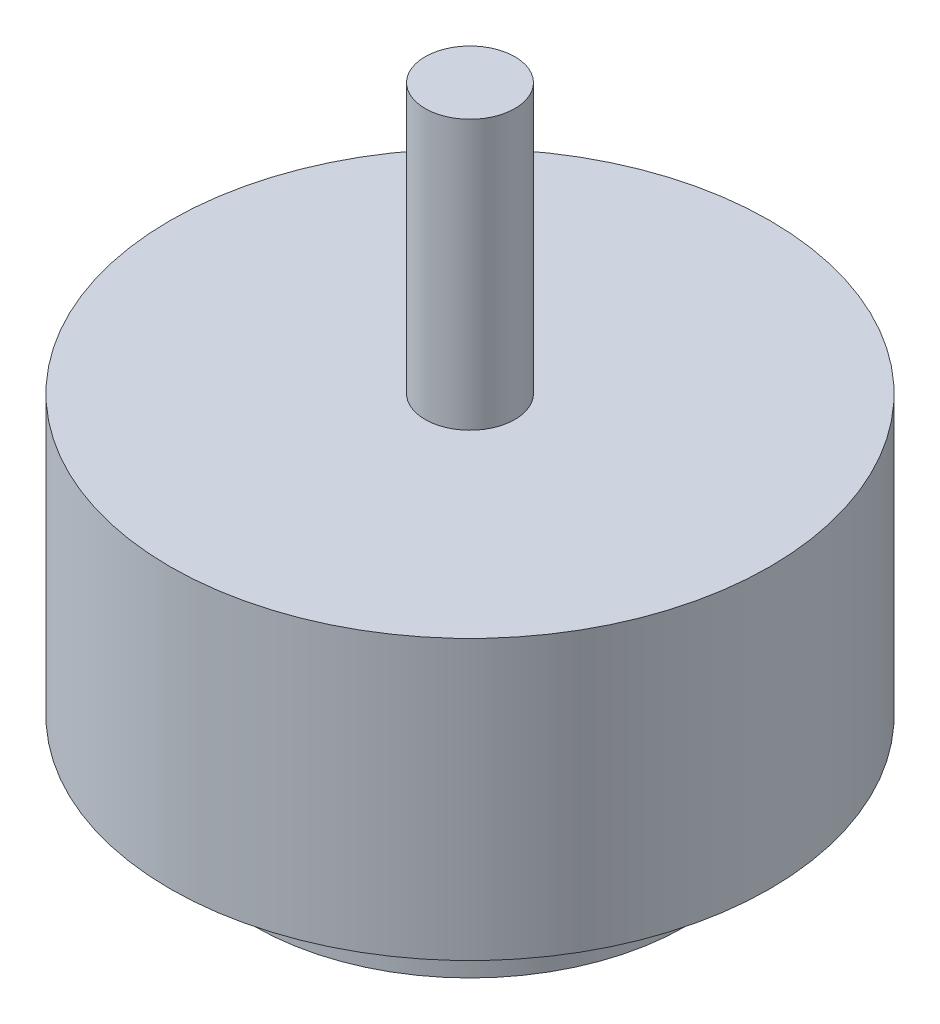
ISO-10303-21;
HEADER;
FILE_DESCRIPTION(('STEP AP214'),'2;1');
FILE_NAME('part.step','',(''),(''),'','','');
FILE_SCHEMA(('AUTOMOTIVE_DESIGN { 1 0 10303 214 1 1 1 1 }'));
ENDSEC;
DATA;
#1=APPLICATION_CONTEXT('core data for automotive mechanical design processes');
#2=APPLICATION_PROTOCOL_DEFINITION('international standard','automotive_design',2000,#1);
#3=PRODUCT_CONTEXT('',#1,'mechanical');
#4=PRODUCT('Part','Part','',(#3));
#5=PRODUCT_RELATED_PRODUCT_CATEGORY('part','',(#4));
#6=PRODUCT_DEFINITION_FORMATION('','',#4);
#7=PRODUCT_DEFINITION_CONTEXT('part definition',#1,'design');
#8=PRODUCT_DEFINITION('design','',#6,#7);
#9=PRODUCT_DEFINITION_SHAPE('','',#8);
#10=(LENGTH_UNIT() NAMED_UNIT(*) SI_UNIT(.MILLI.,.METRE.));
#11=(NAMED_UNIT(*) PLANE_ANGLE_UNIT() SI_UNIT($,.RADIAN.));
#12=(NAMED_UNIT(*) SI_UNIT($,.STERADIAN.) SOLID_ANGLE_UNIT());
#13=UNCERTAINTY_MEASURE_WITH_UNIT(LENGTH_MEASURE(1.E-05),#10,'distance_accuracy_value','');
#14=(GEOMETRIC_REPRESENTATION_CONTEXT(3) GLOBAL_UNCERTAINTY_ASSIGNED_CONTEXT((#13)) GLOBAL_UNIT_ASSIGNED_CONTEXT((#10,
#11,#12)) REPRESENTATION_CONTEXT('',''));
#15=CARTESIAN_POINT('',(0.,0.,0.));
#16=DIRECTION('',(0.,0.,1.));
#17=DIRECTION('',(1.,0.,0.));
#18=AXIS2_PLACEMENT_3D('',#15,#16,#17);
#19=CARTESIAN_POINT('',(0.,0.,0.));
#20=DIRECTION('',(0.,1.,0.));
#21=DIRECTION('',(-1.,0.,0.));
#22=AXIS2_PLACEMENT_3D('',#19,#20,#21);
#23=PLANE('',#22);
#24=CARTESIAN_POINT('',(9.5,0.,0.));
#25=DIRECTION('',(0.,-1.,0.));
#26=DIRECTION('',(1.,0.,0.));
#27=AXIS2_PLACEMENT_3D('',#24,#25,#26);
#28=CIRCLE('',#27,1.5);
#29=CARTESIAN_POINT('',(11.,0.,0.));
#30=VERTEX_POINT('',#29);
#31=EDGE_CURVE('E75',#30,#30,#28,.T.);
#32=ORIENTED_EDGE('',*,*,#31,.F.);
#33=EDGE_LOOP('',(#32));
#34=FACE_BOUND('',#33,.T.);
#35=CARTESIAN_POINT('',(0.,0.,-9.5));
#36=DIRECTION('',(0.,-1.,0.));
#37=DIRECTION('',(1.,0.,0.));
#38=AXIS2_PLACEMENT_3D('',#35,#36,#37);
#39=CIRCLE('',#38,1.5);
#40=CARTESIAN_POINT('',(1.49999999999997,0.,-9.5));
#41=VERTEX_POINT('',#40);
#42=EDGE_CURVE('E110',#41,#41,#39,.T.);
#43=ORIENTED_EDGE('',*,*,#42,.F.);
#44=EDGE_LOOP('',(#43));
#45=FACE_BOUND('',#44,.T.);
#46=CARTESIAN_POINT('',(-9.5,0.,0.));
#47=DIRECTION('',(0.,-1.,0.));
#48=DIRECTION('',(1.,0.,0.));
#49=AXIS2_PLACEMENT_3D('',#46,#47,#48);
#50=CIRCLE('',#49,1.5);
#51=CARTESIAN_POINT('',(-8.,0.,0.));
#52=VERTEX_POINT('',#51);
#53=EDGE_CURVE('E114',#52,#52,#50,.T.);
#54=ORIENTED_EDGE('',*,*,#53,.F.);
#55=EDGE_LOOP('',(#54));
#56=FACE_BOUND('',#55,.T.);
#57=CARTESIAN_POINT('',(0.,0.,9.5));
#58=DIRECTION('',(0.,-1.,0.));
#59=DIRECTION('',(1.,0.,0.));
#60=AXIS2_PLACEMENT_3D('',#57,#58,#59);
#61=CIRCLE('',#60,1.5);
#62=CARTESIAN_POINT('',(1.5000000000001,0.,9.5));
#63=VERTEX_POINT('',#62);
#64=EDGE_CURVE('E52',#63,#63,#61,.T.);
#65=ORIENTED_EDGE('',*,*,#64,.F.);
#66=EDGE_LOOP('',(#65));
#67=FACE_BOUND('',#66,.T.);
#68=CARTESIAN_POINT('',(0.,0.,0.));
#69=DIRECTION('',(0.,1.,0.));
#70=DIRECTION('',(-1.,0.,0.));
#71=AXIS2_PLACEMENT_3D('',#68,#69,#70);
#72=CIRCLE('',#71,12.);
#73=CARTESIAN_POINT('',(-12.,0.,0.));
#74=VERTEX_POINT('',#73);
#75=EDGE_CURVE('E43',#74,#74,#72,.T.);
#76=ORIENTED_EDGE('',*,*,#75,.F.);
#77=EDGE_LOOP('',(#76));
#78=FACE_BOUND('',#77,.T.);
#79=ADVANCED_FACE('F36',(#34,#45,#56,#67,#78),#23,.F.);
#80=CARTESIAN_POINT('',(0.,19.7,0.));
#81=DIRECTION('',(0.,1.,0.));
#82=DIRECTION('',(-1.,0.,0.));
#83=AXIS2_PLACEMENT_3D('',#80,#81,#82);
#84=CYLINDRICAL_SURFACE('',#83,12.);
#85=CARTESIAN_POINT('',(0.,2.,0.));
#86=DIRECTION('',(0.,1.,0.));
#87=DIRECTION('',(-1.,0.,0.));
#88=AXIS2_PLACEMENT_3D('',#85,#86,#87);
#89=CIRCLE('',#88,12.);
#90=CARTESIAN_POINT('',(-12.,2.,0.));
#91=VERTEX_POINT('',#90);
#92=EDGE_CURVE('E48',#91,#91,#89,.T.);
#93=ORIENTED_EDGE('',*,*,#92,.F.);
#94=EDGE_LOOP('',(#93));
#95=FACE_BOUND('',#94,.T.);
#96=ORIENTED_EDGE('',*,*,#75,.T.);
#97=EDGE_LOOP('',(#96));
#98=FACE_BOUND('',#97,.T.);
#99=ADVANCED_FACE('F99',(#95,#98),#84,.T.);
#100=CARTESIAN_POINT('',(12.,2.,0.));
#101=DIRECTION('',(0.,-1.,0.));
#102=DIRECTION('',(1.,0.,0.));
#103=AXIS2_PLACEMENT_3D('',#100,#101,#102);
#104=PLANE('',#103);
#105=CARTESIAN_POINT('',(9.5,2.,0.));
#106=DIRECTION('',(0.,-1.,0.));
#107=DIRECTION('',(1.,0.,0.));
#108=AXIS2_PLACEMENT_3D('',#105,#106,#107);
#109=CIRCLE('',#108,1.5);
#110=CARTESIAN_POINT('',(11.,2.,0.));
#111=VERTEX_POINT('',#110);
#112=EDGE_CURVE('E39',#111,#111,#109,.T.);
#113=ORIENTED_EDGE('',*,*,#112,.T.);
#114=EDGE_LOOP('',(#113));
#115=FACE_BOUND('',#114,.T.);
#116=CARTESIAN_POINT('',(0.,2.,-9.5));
#117=DIRECTION('',(0.,-1.,0.));
#118=DIRECTION('',(1.,0.,0.));
#119=AXIS2_PLACEMENT_3D('',#116,#117,#118);
#120=CIRCLE('',#119,1.5);
#121=CARTESIAN_POINT('',(1.49999999999997,2.,-9.5));
#122=VERTEX_POINT('',#121);
#123=EDGE_CURVE('E77',#122,#122,#120,.T.);
#124=ORIENTED_EDGE('',*,*,#123,.T.);
#125=EDGE_LOOP('',(#124));
#126=FACE_BOUND('',#125,.T.);
#127=CARTESIAN_POINT('',(-9.5,2.,0.));
#128=DIRECTION('',(0.,-1.,0.));
#129=DIRECTION('',(1.,0.,0.));
#130=AXIS2_PLACEMENT_3D('',#127,#128,#129);
#131=CIRCLE('',#130,1.5);
#132=CARTESIAN_POINT('',(-8.,2.,0.));
#133=VERTEX_POINT('',#132);
#134=EDGE_CURVE('E74',#133,#133,#131,.T.);
#135=ORIENTED_EDGE('',*,*,#134,.T.);
#136=EDGE_LOOP('',(#135));
#137=FACE_BOUND('',#136,.T.);
#138=CARTESIAN_POINT('',(0.,2.,9.5));
#139=DIRECTION('',(0.,-1.,0.));
#140=DIRECTION('',(1.,0.,0.));
#141=AXIS2_PLACEMENT_3D('',#138,#139,#140);
#142=CIRCLE('',#141,1.5);
#143=CARTESIAN_POINT('',(1.5000000000001,2.,9.5));
#144=VERTEX_POINT('',#143);
#145=EDGE_CURVE('E71',#144,#144,#142,.T.);
#146=ORIENTED_EDGE('',*,*,#145,.T.);
#147=EDGE_LOOP('',(#146));
#148=FACE_BOUND('',#147,.T.);
#149=CARTESIAN_POINT('',(0.,2.,0.));
#150=DIRECTION('',(0.,1.,0.));
#151=DIRECTION('',(-1.,0.,0.));
#152=AXIS2_PLACEMENT_3D('',#149,#150,#151);
#153=CIRCLE('',#152,4.86486486486486);
#154=CARTESIAN_POINT('',(-4.86486486486486,2.,0.));
#155=VERTEX_POINT('',#154);
#156=EDGE_CURVE('E66',#155,#155,#153,.T.);
#157=ORIENTED_EDGE('',*,*,#156,.F.);
#158=EDGE_LOOP('',(#157));
#159=FACE_BOUND('',#158,.T.);
#160=ORIENTED_EDGE('',*,*,#92,.T.);
#161=EDGE_LOOP('',(#160));
#162=FACE_BOUND('',#161,.T.);
#163=ADVANCED_FACE('F84',(#115,#126,#137,#148,#159,#162),#104,.F.);
#164=CARTESIAN_POINT('',(0.,19.7,0.));
#165=DIRECTION('',(0.,1.,0.));
#166=DIRECTION('',(-1.,0.,0.));
#167=AXIS2_PLACEMENT_3D('',#164,#165,#166);
#168=CYLINDRICAL_SURFACE('',#167,4.86486486486486);
#169=CARTESIAN_POINT('',(0.,4.16216216216216,0.));
#170=DIRECTION('',(0.,1.,0.));
#171=DIRECTION('',(-1.,0.,0.));
#172=AXIS2_PLACEMENT_3D('',#169,#170,#171);
#173=CIRCLE('',#172,4.86486486486486);
#174=CARTESIAN_POINT('',(-4.86486486486486,4.16216216216216,0.));
#175=VERTEX_POINT('',#174);
#176=EDGE_CURVE('E63',#175,#175,#173,.T.);
#177=ORIENTED_EDGE('',*,*,#176,.F.);
#178=EDGE_LOOP('',(#177));
#179=FACE_BOUND('',#178,.T.);
#180=ORIENTED_EDGE('',*,*,#156,.T.);
#181=EDGE_LOOP('',(#180));
#182=FACE_BOUND('',#181,.T.);
#183=ADVANCED_FACE('F133',(#179,#182),#168,.T.);
#184=CARTESIAN_POINT('',(4.86486486486486,4.16216216216216,0.));
#185=DIRECTION('',(0.,1.,0.));
#186=DIRECTION('',(-1.,0.,0.));
#187=AXIS2_PLACEMENT_3D('',#184,#185,#186);
#188=PLANE('',#187);
#189=CARTESIAN_POINT('',(0.,4.16216216216216,0.));
#190=DIRECTION('',(0.,1.,0.));
#191=DIRECTION('',(-1.,0.,0.));
#192=AXIS2_PLACEMENT_3D('',#189,#190,#191);
#193=CIRCLE('',#192,16.7);
#194=CARTESIAN_POINT('',(-16.7,4.16216216216216,0.));
#195=VERTEX_POINT('',#194);
#196=EDGE_CURVE('E60',#195,#195,#193,.T.);
#197=ORIENTED_EDGE('',*,*,#196,.F.);
#198=EDGE_LOOP('',(#197));
#199=FACE_BOUND('',#198,.T.);
#200=ORIENTED_EDGE('',*,*,#176,.T.);
#201=EDGE_LOOP('',(#200));
#202=FACE_BOUND('',#201,.T.);
#203=ADVANCED_FACE('F142',(#199,#202),#188,.F.);
#204=CARTESIAN_POINT('',(0.,19.7,0.));
#205=DIRECTION('',(0.,1.,0.));
#206=DIRECTION('',(-1.,0.,0.));
#207=AXIS2_PLACEMENT_3D('',#204,#205,#206);
#208=CYLINDRICAL_SURFACE('',#207,16.7);
#209=CARTESIAN_POINT('',(0.,19.7,0.));
#210=DIRECTION('',(0.,1.,0.));
#211=DIRECTION('',(-1.,0.,0.));
#212=AXIS2_PLACEMENT_3D('',#209,#210,#211);
#213=CIRCLE('',#212,16.7);
#214=CARTESIAN_POINT('',(-16.7,19.7,0.));
#215=VERTEX_POINT('',#214);
#216=EDGE_CURVE('E57',#215,#215,#213,.T.);
#217=ORIENTED_EDGE('',*,*,#216,.F.);
#218=EDGE_LOOP('',(#217));
#219=FACE_BOUND('',#218,.T.);
#220=ORIENTED_EDGE('',*,*,#196,.T.);
#221=EDGE_LOOP('',(#220));
#222=FACE_BOUND('',#221,.T.);
#223=ADVANCED_FACE('F148',(#219,#222),#208,.T.);
#224=CARTESIAN_POINT('',(16.7,19.7,0.));
#225=DIRECTION('',(0.,-1.,0.));
#226=DIRECTION('',(1.,0.,0.));
#227=AXIS2_PLACEMENT_3D('',#224,#225,#226);
#228=PLANE('',#227);
#229=CARTESIAN_POINT('',(0.,19.7,0.));
#230=DIRECTION('',(0.,1.,0.));
#231=DIRECTION('',(-1.,0.,0.));
#232=AXIS2_PLACEMENT_3D('',#229,#230,#231);
#233=CIRCLE('',#232,2.5);
#234=CARTESIAN_POINT('',(-2.5,19.7,0.));
#235=VERTEX_POINT('',#234);
#236=EDGE_CURVE('E11',#235,#235,#233,.T.);
#237=ORIENTED_EDGE('',*,*,#236,.F.);
#238=EDGE_LOOP('',(#237));
#239=FACE_BOUND('',#238,.T.);
#240=ORIENTED_EDGE('',*,*,#216,.T.);
#241=EDGE_LOOP('',(#240));
#242=FACE_BOUND('',#241,.T.);
#243=ADVANCED_FACE('F155',(#239,#242),#228,.F.);
#244=CARTESIAN_POINT('',(0.,76.4710678118655,0.));
#245=DIRECTION('',(0.,-1.,0.));
#246=DIRECTION('',(1.,0.,0.));
#247=AXIS2_PLACEMENT_3D('',#244,#245,#246);
#248=CYLINDRICAL_SURFACE('',#247,2.5);
#249=ORIENTED_EDGE('',*,*,#236,.T.);
#250=EDGE_LOOP('',(#249));
#251=FACE_BOUND('',#250,.T.);
#252=CARTESIAN_POINT('',(0.,34.7,0.));
#253=DIRECTION('',(0.,1.,0.));
#254=DIRECTION('',(-1.,0.,0.));
#255=AXIS2_PLACEMENT_3D('',#252,#253,#254);
#256=CIRCLE('',#255,2.5);
#257=CARTESIAN_POINT('',(-2.5,34.7,0.));
#258=VERTEX_POINT('',#257);
#259=EDGE_CURVE('E54',#258,#258,#256,.T.);
#260=ORIENTED_EDGE('',*,*,#259,.F.);
#261=EDGE_LOOP('',(#260));
#262=FACE_BOUND('',#261,.T.);
#263=ADVANCED_FACE('F159',(#251,#262),#248,.T.);
#264=CARTESIAN_POINT('',(0.,34.7,0.));
#265=DIRECTION('',(0.,1.,0.));
#266=DIRECTION('',(-1.,0.,0.));
#267=AXIS2_PLACEMENT_3D('',#264,#265,#266);
#268=PLANE('',#267);
#269=ORIENTED_EDGE('',*,*,#259,.T.);
#270=EDGE_LOOP('',(#269));
#271=FACE_BOUND('',#270,.T.);
#272=ADVANCED_FACE('F161',(#271),#268,.T.);
#273=CARTESIAN_POINT('',(0.,4.,9.5));
#274=DIRECTION('',(0.,-1.,0.));
#275=DIRECTION('',(1.,0.,0.));
#276=AXIS2_PLACEMENT_3D('',#273,#274,#275);
#277=CYLINDRICAL_SURFACE('',#276,1.5);
#278=ORIENTED_EDGE('',*,*,#64,.T.);
#279=EDGE_LOOP('',(#278));
#280=FACE_BOUND('',#279,.T.);
#281=ORIENTED_EDGE('',*,*,#145,.F.);
#282=EDGE_LOOP('',(#281));
#283=FACE_BOUND('',#282,.T.);
#284=ADVANCED_FACE('F127',(#280,#283),#277,.F.);
#285=CARTESIAN_POINT('',(-9.5,4.,0.));
#286=DIRECTION('',(0.,-1.,0.));
#287=DIRECTION('',(1.,0.,0.));
#288=AXIS2_PLACEMENT_3D('',#285,#286,#287);
#289=CYLINDRICAL_SURFACE('',#288,1.5);
#290=ORIENTED_EDGE('',*,*,#53,.T.);
#291=EDGE_LOOP('',(#290));
#292=FACE_BOUND('',#291,.T.);
#293=ORIENTED_EDGE('',*,*,#134,.F.);
#294=EDGE_LOOP('',(#293));
#295=FACE_BOUND('',#294,.T.);
#296=ADVANCED_FACE('F94',(#292,#295),#289,.F.);
#297=CARTESIAN_POINT('',(0.,4.,-9.5));
#298=DIRECTION('',(0.,-1.,0.));
#299=DIRECTION('',(1.,0.,0.));
#300=AXIS2_PLACEMENT_3D('',#297,#298,#299);
#301=CYLINDRICAL_SURFACE('',#300,1.5);
#302=ORIENTED_EDGE('',*,*,#42,.T.);
#303=EDGE_LOOP('',(#302));
#304=FACE_BOUND('',#303,.T.);
#305=ORIENTED_EDGE('',*,*,#123,.F.);
#306=EDGE_LOOP('',(#305));
#307=FACE_BOUND('',#306,.T.);
#308=ADVANCED_FACE('F88',(#304,#307),#301,.F.);
#309=CARTESIAN_POINT('',(9.5,4.,0.));
#310=DIRECTION('',(0.,-1.,0.));
#311=DIRECTION('',(1.,0.,0.));
#312=AXIS2_PLACEMENT_3D('',#309,#310,#311);
#313=CYLINDRICAL_SURFACE('',#312,1.5);
#314=ORIENTED_EDGE('',*,*,#31,.T.);
#315=EDGE_LOOP('',(#314));
#316=FACE_BOUND('',#315,.T.);
#317=ORIENTED_EDGE('',*,*,#112,.F.);
#318=EDGE_LOOP('',(#317));
#319=FACE_BOUND('',#318,.T.);
#320=ADVANCED_FACE('F86',(#316,#319),#313,.F.);
#321=CLOSED_SHELL('',(#79,#99,#163,#183,#203,#223,#243,#263,#272,#284,#296,#308,#320));
#322=MANIFOLD_SOLID_BREP('B2',#321);
#323=ADVANCED_BREP_SHAPE_REPRESENTATION('',(#18,#322),#14);
#324=SHAPE_DEFINITION_REPRESENTATION(#9,#323);
ENDSEC;
END-ISO-10303-21;
